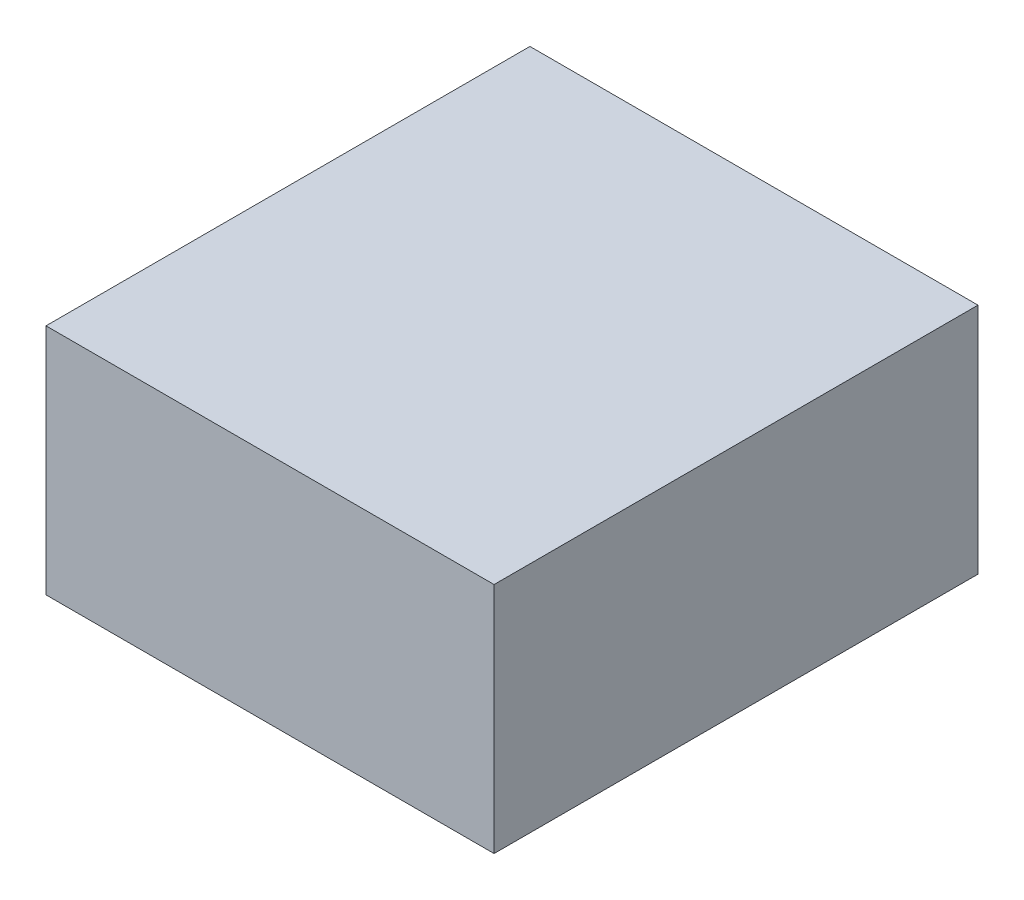
ISO-10303-21;
HEADER;
FILE_DESCRIPTION(('STEP AP214'),'2;1');
FILE_NAME('part.step','',(''),(''),'','','');
FILE_SCHEMA(('AUTOMOTIVE_DESIGN { 1 0 10303 214 1 1 1 1 }'));
ENDSEC;
DATA;
#1=APPLICATION_CONTEXT('core data for automotive mechanical design processes');
#2=APPLICATION_PROTOCOL_DEFINITION('international standard','automotive_design',2000,#1);
#3=PRODUCT_CONTEXT('',#1,'mechanical');
#4=PRODUCT('Part','Part','',(#3));
#5=PRODUCT_RELATED_PRODUCT_CATEGORY('part','',(#4));
#6=PRODUCT_DEFINITION_FORMATION('','',#4);
#7=PRODUCT_DEFINITION_CONTEXT('part definition',#1,'design');
#8=PRODUCT_DEFINITION('design','',#6,#7);
#9=PRODUCT_DEFINITION_SHAPE('','',#8);
#10=(LENGTH_UNIT() NAMED_UNIT(*) SI_UNIT(.MILLI.,.METRE.));
#11=(NAMED_UNIT(*) PLANE_ANGLE_UNIT() SI_UNIT($,.RADIAN.));
#12=(NAMED_UNIT(*) SI_UNIT($,.STERADIAN.) SOLID_ANGLE_UNIT());
#13=UNCERTAINTY_MEASURE_WITH_UNIT(LENGTH_MEASURE(1.E-05),#10,'distance_accuracy_value','');
#14=(GEOMETRIC_REPRESENTATION_CONTEXT(3) GLOBAL_UNCERTAINTY_ASSIGNED_CONTEXT((#13)) GLOBAL_UNIT_ASSIGNED_CONTEXT((#10,
#11,#12)) REPRESENTATION_CONTEXT('',''));
#15=CARTESIAN_POINT('',(0.,0.,0.));
#16=DIRECTION('',(0.,0.,1.));
#17=DIRECTION('',(1.,0.,0.));
#18=AXIS2_PLACEMENT_3D('',#15,#16,#17);
#19=CARTESIAN_POINT('',(3.8212,3.0956,3.2592));
#20=DIRECTION('',(0.,1.,0.));
#21=DIRECTION('',(0.,0.,1.));
#22=AXIS2_PLACEMENT_3D('',#19,#20,#21);
#23=PLANE('',#22);
#24=DIRECTION('',(0.,0.,1.));
#25=VECTOR('',#24,1.);
#26=CARTESIAN_POINT('',(3.8212,3.0956,3.2592));
#27=LINE('',#26,#25);
#28=CARTESIAN_POINT('',(3.8212,3.0956,2.9892));
#29=VERTEX_POINT('',#28);
#30=CARTESIAN_POINT('',(3.8212,3.0956,3.2592));
#31=VERTEX_POINT('',#30);
#32=EDGE_CURVE('E11',#29,#31,#27,.T.);
#33=ORIENTED_EDGE('',*,*,#32,.T.);
#34=DIRECTION('',(1.,0.,0.));
#35=VECTOR('',#34,1.);
#36=CARTESIAN_POINT('',(3.8212,3.0956,3.2592));
#37=LINE('',#36,#35);
#38=CARTESIAN_POINT('',(4.0712,3.0956,3.2592));
#39=VERTEX_POINT('',#38);
#40=EDGE_CURVE('E24',#31,#39,#37,.T.);
#41=ORIENTED_EDGE('',*,*,#40,.T.);
#42=DIRECTION('',(0.,0.,-1.));
#43=VECTOR('',#42,1.);
#44=CARTESIAN_POINT('',(4.0712,3.0956,3.2592));
#45=LINE('',#44,#43);
#46=CARTESIAN_POINT('',(4.0712,3.0956,2.9892));
#47=VERTEX_POINT('',#46);
#48=EDGE_CURVE('E88',#39,#47,#45,.T.);
#49=ORIENTED_EDGE('',*,*,#48,.T.);
#50=DIRECTION('',(-1.,0.,0.));
#51=VECTOR('',#50,1.);
#52=CARTESIAN_POINT('',(3.8212,3.0956,2.9892));
#53=LINE('',#52,#51);
#54=EDGE_CURVE('E59',#47,#29,#53,.T.);
#55=ORIENTED_EDGE('',*,*,#54,.T.);
#56=EDGE_LOOP('',(#33,#41,#49,#55));
#57=FACE_BOUND('',#56,.T.);
#58=ADVANCED_FACE('F17',(#57),#23,.T.);
#59=CARTESIAN_POINT('',(3.8212,2.9656,3.2592));
#60=DIRECTION('',(0.,0.,1.));
#61=DIRECTION('',(1.,0.,0.));
#62=AXIS2_PLACEMENT_3D('',#59,#60,#61);
#63=PLANE('',#62);
#64=DIRECTION('',(0.,1.,0.));
#65=VECTOR('',#64,1.);
#66=CARTESIAN_POINT('',(4.0712,2.9656,3.2592));
#67=LINE('',#66,#65);
#68=CARTESIAN_POINT('',(4.0712,2.9656,3.2592));
#69=VERTEX_POINT('',#68);
#70=EDGE_CURVE('E75',#69,#39,#67,.T.);
#71=ORIENTED_EDGE('',*,*,#70,.T.);
#72=ORIENTED_EDGE('',*,*,#40,.F.);
#73=DIRECTION('',(0.,-1.,0.));
#74=VECTOR('',#73,1.);
#75=CARTESIAN_POINT('',(3.8212,2.9656,3.2592));
#76=LINE('',#75,#74);
#77=CARTESIAN_POINT('',(3.8212,2.9656,3.2592));
#78=VERTEX_POINT('',#77);
#79=EDGE_CURVE('E84',#31,#78,#76,.T.);
#80=ORIENTED_EDGE('',*,*,#79,.T.);
#81=DIRECTION('',(1.,0.,0.));
#82=VECTOR('',#81,1.);
#83=CARTESIAN_POINT('',(3.8212,2.9656,3.2592));
#84=LINE('',#83,#82);
#85=EDGE_CURVE('E82',#78,#69,#84,.T.);
#86=ORIENTED_EDGE('',*,*,#85,.T.);
#87=EDGE_LOOP('',(#71,#72,#80,#86));
#88=FACE_BOUND('',#87,.T.);
#89=ADVANCED_FACE('F90',(#88),#63,.T.);
#90=CARTESIAN_POINT('',(3.8212,2.9656,2.9892));
#91=DIRECTION('',(-1.,0.,0.));
#92=DIRECTION('',(0.,0.,1.));
#93=AXIS2_PLACEMENT_3D('',#90,#91,#92);
#94=PLANE('',#93);
#95=ORIENTED_EDGE('',*,*,#79,.F.);
#96=ORIENTED_EDGE('',*,*,#32,.F.);
#97=DIRECTION('',(0.,-1.,0.));
#98=VECTOR('',#97,1.);
#99=CARTESIAN_POINT('',(3.8212,2.9656,2.9892));
#100=LINE('',#99,#98);
#101=CARTESIAN_POINT('',(3.8212,2.9656,2.9892));
#102=VERTEX_POINT('',#101);
#103=EDGE_CURVE('E80',#29,#102,#100,.T.);
#104=ORIENTED_EDGE('',*,*,#103,.T.);
#105=DIRECTION('',(0.,0.,1.));
#106=VECTOR('',#105,1.);
#107=CARTESIAN_POINT('',(3.8212,2.9656,2.9892));
#108=LINE('',#107,#106);
#109=EDGE_CURVE('E63',#102,#78,#108,.T.);
#110=ORIENTED_EDGE('',*,*,#109,.T.);
#111=EDGE_LOOP('',(#95,#96,#104,#110));
#112=FACE_BOUND('',#111,.T.);
#113=ADVANCED_FACE('F91',(#112),#94,.T.);
#114=CARTESIAN_POINT('',(3.8212,2.9656,2.9892));
#115=DIRECTION('',(0.,0.,-1.));
#116=DIRECTION('',(-1.,0.,0.));
#117=AXIS2_PLACEMENT_3D('',#114,#115,#116);
#118=PLANE('',#117);
#119=ORIENTED_EDGE('',*,*,#103,.F.);
#120=ORIENTED_EDGE('',*,*,#54,.F.);
#121=DIRECTION('',(0.,-1.,0.));
#122=VECTOR('',#121,1.);
#123=CARTESIAN_POINT('',(4.0712,2.9656,2.9892));
#124=LINE('',#123,#122);
#125=CARTESIAN_POINT('',(4.0712,2.9656,2.9892));
#126=VERTEX_POINT('',#125);
#127=EDGE_CURVE('E54',#47,#126,#124,.T.);
#128=ORIENTED_EDGE('',*,*,#127,.T.);
#129=DIRECTION('',(-1.,0.,0.));
#130=VECTOR('',#129,1.);
#131=CARTESIAN_POINT('',(3.8212,2.9656,2.9892));
#132=LINE('',#131,#130);
#133=EDGE_CURVE('E58',#126,#102,#132,.T.);
#134=ORIENTED_EDGE('',*,*,#133,.T.);
#135=EDGE_LOOP('',(#119,#120,#128,#134));
#136=FACE_BOUND('',#135,.T.);
#137=ADVANCED_FACE('F57',(#136),#118,.T.);
#138=CARTESIAN_POINT('',(4.0712,2.9656,2.9892));
#139=DIRECTION('',(1.,0.,0.));
#140=DIRECTION('',(0.,1.,0.));
#141=AXIS2_PLACEMENT_3D('',#138,#139,#140);
#142=PLANE('',#141);
#143=ORIENTED_EDGE('',*,*,#127,.F.);
#144=ORIENTED_EDGE('',*,*,#48,.F.);
#145=ORIENTED_EDGE('',*,*,#70,.F.);
#146=DIRECTION('',(0.,0.,-1.));
#147=VECTOR('',#146,1.);
#148=CARTESIAN_POINT('',(4.0712,2.9656,2.9892));
#149=LINE('',#148,#147);
#150=EDGE_CURVE('E70',#69,#126,#149,.T.);
#151=ORIENTED_EDGE('',*,*,#150,.T.);
#152=EDGE_LOOP('',(#143,#144,#145,#151));
#153=FACE_BOUND('',#152,.T.);
#154=ADVANCED_FACE('F73',(#153),#142,.T.);
#155=CARTESIAN_POINT('',(3.8212,2.9656,3.2592));
#156=DIRECTION('',(0.,1.,0.));
#157=DIRECTION('',(0.,0.,1.));
#158=AXIS2_PLACEMENT_3D('',#155,#156,#157);
#159=PLANE('',#158);
#160=ORIENTED_EDGE('',*,*,#150,.F.);
#161=ORIENTED_EDGE('',*,*,#85,.F.);
#162=ORIENTED_EDGE('',*,*,#109,.F.);
#163=ORIENTED_EDGE('',*,*,#133,.F.);
#164=EDGE_LOOP('',(#160,#161,#162,#163));
#165=FACE_BOUND('',#164,.T.);
#166=ADVANCED_FACE('F68',(#165),#159,.F.);
#167=CLOSED_SHELL('',(#58,#89,#113,#137,#154,#166));
#168=MANIFOLD_SOLID_BREP('B1',#167);
#169=ADVANCED_BREP_SHAPE_REPRESENTATION('',(#18,#168),#14);
#170=SHAPE_DEFINITION_REPRESENTATION(#9,#169);
ENDSEC;
END-ISO-10303-21;
